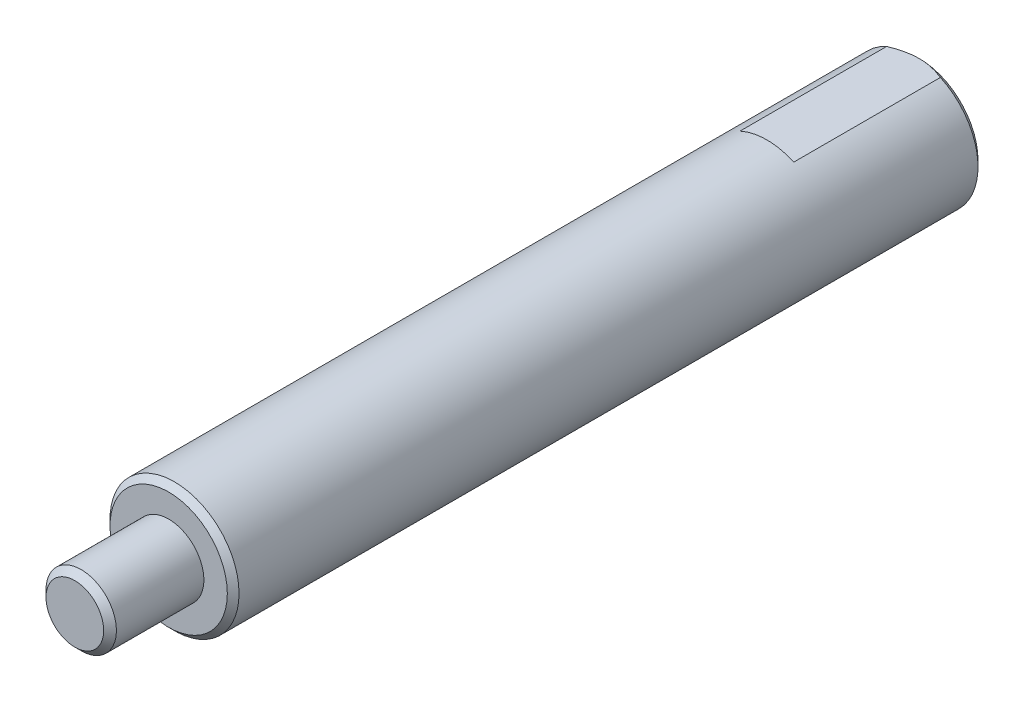
ISO-10303-21;
HEADER;
FILE_DESCRIPTION(('STEP AP214'),'2;1');
FILE_NAME('part.step','',(''),(''),'','','');
FILE_SCHEMA(('AUTOMOTIVE_DESIGN { 1 0 10303 214 1 1 1 1 }'));
ENDSEC;
DATA;
#1=APPLICATION_CONTEXT('core data for automotive mechanical design processes');
#2=APPLICATION_PROTOCOL_DEFINITION('international standard','automotive_design',2000,#1);
#3=PRODUCT_CONTEXT('',#1,'mechanical');
#4=PRODUCT('Part','Part','',(#3));
#5=PRODUCT_RELATED_PRODUCT_CATEGORY('part','',(#4));
#6=PRODUCT_DEFINITION_FORMATION('','',#4);
#7=PRODUCT_DEFINITION_CONTEXT('part definition',#1,'design');
#8=PRODUCT_DEFINITION('design','',#6,#7);
#9=PRODUCT_DEFINITION_SHAPE('','',#8);
#10=(LENGTH_UNIT() NAMED_UNIT(*) SI_UNIT(.MILLI.,.METRE.));
#11=(NAMED_UNIT(*) PLANE_ANGLE_UNIT() SI_UNIT($,.RADIAN.));
#12=(NAMED_UNIT(*) SI_UNIT($,.STERADIAN.) SOLID_ANGLE_UNIT());
#13=UNCERTAINTY_MEASURE_WITH_UNIT(LENGTH_MEASURE(1.E-05),#10,'distance_accuracy_value','');
#14=(GEOMETRIC_REPRESENTATION_CONTEXT(3) GLOBAL_UNCERTAINTY_ASSIGNED_CONTEXT((#13)) GLOBAL_UNIT_ASSIGNED_CONTEXT((#10,
#11,#12)) REPRESENTATION_CONTEXT('',''));
#15=CARTESIAN_POINT('',(0.,0.,0.));
#16=DIRECTION('',(0.,0.,1.));
#17=DIRECTION('',(1.,0.,0.));
#18=AXIS2_PLACEMENT_3D('',#15,#16,#17);
#19=CARTESIAN_POINT('',(0.,0.,0.500000000000014));
#20=DIRECTION('',(0.,0.,1.));
#21=DIRECTION('',(1.,0.,0.));
#22=AXIS2_PLACEMENT_3D('',#19,#20,#21);
#23=CONICAL_SURFACE('',#22,5.5,0.785398163397436);
#24=CARTESIAN_POINT('',(14.6848091307523,5.,10.5126921972504));
#25=CARTESIAN_POINT('',(14.4453208226164,5.,10.2859896541326));
#26=CARTESIAN_POINT('',(14.2055496886508,5.,10.0595855916862));
#27=CARTESIAN_POINT('',(13.7253433237663,5.,9.60748006149909));
#28=CARTESIAN_POINT('',(13.4849080888771,5.,9.38177859797625));
#29=CARTESIAN_POINT('',(12.7618962256913,5.,8.70536049882663));
#30=CARTESIAN_POINT('',(12.2781765081113,5.,8.25586410270808));
#31=CARTESIAN_POINT('',(11.2855202754837,5.,7.34194274282302));
#32=CARTESIAN_POINT('',(10.7764003173806,5.,6.87771631839156));
#33=CARTESIAN_POINT('',(10.0081237078524,5.,6.18705169530905));
#34=CARTESIAN_POINT('',(9.75140731219663,5.,5.95789999795178));
#35=CARTESIAN_POINT('',(9.23598125315529,5.,5.50185127115912));
#36=CARTESIAN_POINT('',(8.97727160895964,5.,5.27495422006529));
#37=CARTESIAN_POINT('',(8.45777334373329,5.,4.82431921159379));
#38=CARTESIAN_POINT('',(8.19698831207965,5.,4.60057712329857));
#39=CARTESIAN_POINT('',(7.6723358301828,5.,4.15670009726214));
#40=CARTESIAN_POINT('',(7.40846821574943,5.,3.93656535317621));
#41=CARTESIAN_POINT('',(6.87588577364982,5.,3.50025684420251));
#42=CARTESIAN_POINT('',(6.60715699098744,5.,3.28410005066126));
#43=CARTESIAN_POINT('',(6.06467897085518,5.,2.85824880719032));
#44=CARTESIAN_POINT('',(5.79093054202088,5.,2.64855333071812));
#45=CARTESIAN_POINT('',(5.24247824545996,5.,2.24225256251813));
#46=CARTESIAN_POINT('',(4.96790940819455,5.,2.04546689887278));
#47=CARTESIAN_POINT('',(4.54965992503194,5.,1.75937405975111));
#48=CARTESIAN_POINT('',(4.40911425501491,5.,1.66548481679918));
#49=CARTESIAN_POINT('',(4.12560555295664,5.,1.48143277641852));
#50=CARTESIAN_POINT('',(3.98264266122852,5.,1.39126976373159));
#51=CARTESIAN_POINT('',(3.69483138879475,5.,1.21601413329341));
#52=CARTESIAN_POINT('',(3.54999993591885,5.,1.13089382459616));
#53=CARTESIAN_POINT('',(3.25720950323702,5.,0.966134750499159));
#54=CARTESIAN_POINT('',(3.10925012756201,5.,0.886496684425168));
#55=CARTESIAN_POINT('',(2.81011276522707,5.,0.734125373534899));
#56=CARTESIAN_POINT('',(2.65894061859072,5.,0.661380726321783));
#57=CARTESIAN_POINT('',(2.35286256329088,5.,0.524242686166348));
#58=CARTESIAN_POINT('',(2.19795788752465,5.,0.459846579258957));
#59=CARTESIAN_POINT('',(1.96757107505065,5.,0.372774300731431));
#60=CARTESIAN_POINT('',(1.89359074216696,5.,0.346101437024991));
#61=CARTESIAN_POINT('',(1.74478391072081,5.,0.29522226419522));
#62=CARTESIAN_POINT('',(1.66995737392946,5.,0.271016067006829));
#63=CARTESIAN_POINT('',(1.44419485912767,5.,0.202417832217304));
#64=CARTESIAN_POINT('',(1.29200049197949,5.,0.162055560028303));
#65=CARTESIAN_POINT('',(0.985646477349682,5.,0.0940487123557584));
#66=CARTESIAN_POINT('',(0.831502220583022,5.,0.0663354854096574));
#67=CARTESIAN_POINT('',(0.521341182897351,5.,0.0247588689838609));
#68=CARTESIAN_POINT('',(0.365324622093381,5.,0.0108938672889773));
#69=CARTESIAN_POINT('',(0.0516160098077244,5.,-0.00220571628048557));
#70=CARTESIAN_POINT('',(-0.106080254029073,5.,-0.00134130349867582));
#71=CARTESIAN_POINT('',(-0.420679844237679,5.,0.0152055027274822));
#72=CARTESIAN_POINT('',(-0.577583163482885,5.,0.0308880291126165));
#73=CARTESIAN_POINT('',(-0.890071145810949,5.,0.0762385891217889));
#74=CARTESIAN_POINT('',(-1.04564624986767,5.,0.105971488681403));
#75=CARTESIAN_POINT('',(-1.35387421816534,5.,0.177884717280971));
#76=CARTESIAN_POINT('',(-1.50652647420562,5.,0.220067607636027));
#77=CARTESIAN_POINT('',(-1.8989922814402,5.,0.343556358459082));
#78=CARTESIAN_POINT('',(-2.13618939052751,5.,0.433155135839272));
#79=CARTESIAN_POINT('',(-2.60192397109214,5.,0.632544932175374));
#80=CARTESIAN_POINT('',(-2.83045405488646,5.,0.7423527303823));
#81=CARTESIAN_POINT('',(-3.16847602424685,5.,0.918609391765032));
#82=CARTESIAN_POINT('',(-3.28087217249392,5.,0.979600606049237));
#83=CARTESIAN_POINT('',(-3.50386518493547,5.,1.10479681409978));
#84=CARTESIAN_POINT('',(-3.6144620260023,5.,1.16900184913222));
#85=CARTESIAN_POINT('',(-3.83396126584069,5.,1.30012039469541));
#86=CARTESIAN_POINT('',(-3.94286443721314,5.,1.36703261693885));
#87=CARTESIAN_POINT('',(-4.1591802464683,5.,1.50320934076131));
#88=CARTESIAN_POINT('',(-4.26659294268043,5.,1.57247374992024));
#89=CARTESIAN_POINT('',(-4.62241235734253,5.,1.80671898738853));
#90=CARTESIAN_POINT('',(-4.86786587008758,5.,1.97619150842273));
#91=CARTESIAN_POINT('',(-5.3531269237751,5.,2.32306349681855));
#92=CARTESIAN_POINT('',(-5.59293322072314,5.,2.50046468625841));
#93=CARTESIAN_POINT('',(-6.06824445724655,5.,2.86127560728337));
#94=CARTESIAN_POINT('',(-6.30374612411092,5.,3.04468963665715));
#95=CARTESIAN_POINT('',(-6.77116765089281,5.,3.41597165684243));
#96=CARTESIAN_POINT('',(-7.0030877979389,5.,3.6038392875176));
#97=CARTESIAN_POINT('',(-7.46479831203241,5.,3.98364854891996));
#98=CARTESIAN_POINT('',(-7.69457957218798,5.,4.17560122632323));
#99=CARTESIAN_POINT('',(-8.15180534086126,5.,4.56227258082238));
#100=CARTESIAN_POINT('',(-8.37924980937841,5.,4.7569913051312));
#101=CARTESIAN_POINT('',(-8.83212152767281,5.,5.14856830192763));
#102=CARTESIAN_POINT('',(-9.05754957794634,5.,5.34542564979219));
#103=CARTESIAN_POINT('',(-9.50680949169838,5.,5.74095449633187));
#104=CARTESIAN_POINT('',(-9.73064134364065,5.,5.93962600809492));
#105=CARTESIAN_POINT('',(-10.3554269609866,5.,6.49792304019951));
#106=CARTESIAN_POINT('',(-10.7548894567916,5.,6.85921712231994));
#107=CARTESIAN_POINT('',(-11.5506520435187,5.,7.58535654201267));
#108=CARTESIAN_POINT('',(-11.9469517546501,5.,7.95020229473558));
#109=CARTESIAN_POINT('',(-12.7346046209224,5.,8.68021687945504));
#110=CARTESIAN_POINT('',(-13.1259732089029,5.,9.04536907885108));
#111=CARTESIAN_POINT('',(-13.9067337252454,5.,9.77766414097995));
#112=CARTESIAN_POINT('',(-14.2961259422756,5.,10.1448066957958));
#113=CARTESIAN_POINT('',(-14.6848091307523,5.,10.5126921972504));
#114=B_SPLINE_CURVE_WITH_KNOTS('',3,(#24,#25,#26,#27,#28,#29,#30,#31,#32,#33,#34,#35,#36,#37,
#38,#39,#40,#41,#42,#43,#44,#45,#46,#47,#48,#49,#50,#51,#52,#53,#54,#55,#56,#57,#58,#59,#60,#61,
#62,#63,#64,#65,#66,#67,#68,#69,#70,#71,#72,#73,#74,#75,#76,#77,#78,#79,#80,#81,#82,#83,#84,#85,
#86,#87,#88,#89,#90,#91,#92,#93,#94,#95,#96,#97,#98,#99,#100,#101,#102,#103,#104,#105,#106,#107,
#108,#109,#110,#111,#112,#113),.UNSPECIFIED.,.F.,.F.,(4,2,2,2,2,2,2,2,2,2,2,2,2,2,2,2,2,2,2,2,2,
2,2,2,2,2,2,2,2,2,2,2,2,2,2,2,2,2,2,2,2,2,2,2,4),(0.,0.989311923310689,1.97862977419087,
3.95959337600434,6.02651317448638,7.05884240046647,8.09116170015287,9.12197286482393,
10.152839187069,11.1873903696079,12.2217763312275,13.2349233326129,13.7419424161495,
14.248932168968,14.7528143978993,15.2567607843965,15.7598584856985,16.262792226395,
16.4986794127487,16.7345772986724,17.2064516788891,17.6757336299648,18.1449609407026,
18.6173431093413,19.0897295159994,19.5643184047898,20.0390049980705,20.7982977886032,
21.5582238763938,21.9418160729213,22.3254131961139,22.7088298733644,23.0922315031272,
23.9868071792112,24.881578107225,25.7770031658041,26.6723560620074,27.5705534283755,
28.4687661443101,29.3666048627675,30.2644500636273,31.8802558929096,33.4962529155438,
35.1020309687593,36.7075673131423),.UNSPECIFIED.);
#115=CARTESIAN_POINT('',(2.29128784747799,5.,0.499999999999995));
#116=VERTEX_POINT('',#115);
#117=CARTESIAN_POINT('',(0.,5.,0.));
#118=VERTEX_POINT('',#117);
#119=EDGE_CURVE('E56',#116,#118,#114,.T.);
#120=ORIENTED_EDGE('',*,*,#119,.F.);
#121=CARTESIAN_POINT('',(0.,0.,0.500000000000014));
#122=DIRECTION('',(0.,0.,1.));
#123=DIRECTION('',(1.,0.,0.));
#124=AXIS2_PLACEMENT_3D('',#121,#122,#123);
#125=CIRCLE('',#124,5.5);
#126=CARTESIAN_POINT('',(2.29128784747792,-5.,0.500000000000014));
#127=VERTEX_POINT('',#126);
#128=EDGE_CURVE('E125',#127,#116,#125,.T.);
#129=ORIENTED_EDGE('',*,*,#128,.F.);
#130=CARTESIAN_POINT('',(-14.6848091307523,-5.,10.5126921972504));
#131=CARTESIAN_POINT('',(-14.4453208226164,-5.,10.2859896541326));
#132=CARTESIAN_POINT('',(-14.2055496886508,-5.,10.0595855916861));
#133=CARTESIAN_POINT('',(-13.7253433237663,-5.,9.60748006149909));
#134=CARTESIAN_POINT('',(-13.4849080888771,-5.,9.38177859797625));
#135=CARTESIAN_POINT('',(-12.7618962256913,-5.,8.70536049882663));
#136=CARTESIAN_POINT('',(-12.2781765081113,-5.,8.25586410270807));
#137=CARTESIAN_POINT('',(-11.2855202754837,-5.,7.34194274282302));
#138=CARTESIAN_POINT('',(-10.7764003173806,-5.,6.87771631839156));
#139=CARTESIAN_POINT('',(-10.0081237078524,-5.,6.18705169530905));
#140=CARTESIAN_POINT('',(-9.75140731219662,-5.,5.95789999795178));
#141=CARTESIAN_POINT('',(-9.23598125315529,-5.,5.50185127115912));
#142=CARTESIAN_POINT('',(-8.97727160895964,-5.,5.27495422006529));
#143=CARTESIAN_POINT('',(-8.45777334373329,-5.,4.82431921159379));
#144=CARTESIAN_POINT('',(-8.19698831207965,-5.,4.60057712329857));
#145=CARTESIAN_POINT('',(-7.6723358301828,-5.,4.15670009726214));
#146=CARTESIAN_POINT('',(-7.40846821574943,-5.,3.93656535317622));
#147=CARTESIAN_POINT('',(-6.87588577364982,-5.,3.50025684420251));
#148=CARTESIAN_POINT('',(-6.60715699098744,-5.,3.28410005066126));
#149=CARTESIAN_POINT('',(-6.06467897085518,-5.,2.85824880719032));
#150=CARTESIAN_POINT('',(-5.79093054202088,-5.,2.64855333071812));
#151=CARTESIAN_POINT('',(-5.24247824545997,-5.,2.24225256251813));
#152=CARTESIAN_POINT('',(-4.96790940819455,-5.,2.04546689887279));
#153=CARTESIAN_POINT('',(-4.54965992503194,-5.,1.75937405975111));
#154=CARTESIAN_POINT('',(-4.40911425501492,-5.,1.66548481679918));
#155=CARTESIAN_POINT('',(-4.12560555295664,-5.,1.48143277641852));
#156=CARTESIAN_POINT('',(-3.98264266122852,-5.,1.39126976373159));
#157=CARTESIAN_POINT('',(-3.69483138879475,-5.,1.21601413329342));
#158=CARTESIAN_POINT('',(-3.54999993591886,-5.,1.13089382459616));
#159=CARTESIAN_POINT('',(-3.25720950323703,-5.,0.966134750499163));
#160=CARTESIAN_POINT('',(-3.10925012756201,-5.,0.886496684425172));
#161=CARTESIAN_POINT('',(-2.81011276522707,-5.,0.734125373534903));
#162=CARTESIAN_POINT('',(-2.65894061859073,-5.,0.661380726321787));
#163=CARTESIAN_POINT('',(-2.35286256329088,-5.,0.524242686166353));
#164=CARTESIAN_POINT('',(-2.19795788752466,-5.,0.45984657925896));
#165=CARTESIAN_POINT('',(-1.96757107505066,-5.,0.372774300731434));
#166=CARTESIAN_POINT('',(-1.89359074216697,-5.,0.346101437024994));
#167=CARTESIAN_POINT('',(-1.74478391072082,-5.,0.295222264195223));
#168=CARTESIAN_POINT('',(-1.66995737392947,-5.,0.271016067006833));
#169=CARTESIAN_POINT('',(-1.44419485912768,-5.,0.202417832217307));
#170=CARTESIAN_POINT('',(-1.2920004919795,-5.,0.162055560028306));
#171=CARTESIAN_POINT('',(-0.985646477349691,-5.,0.0940487123557596));
#172=CARTESIAN_POINT('',(-0.831502220583031,-5.,0.0663354854096585));
#173=CARTESIAN_POINT('',(-0.521341182897359,-5.,0.0247588689838614));
#174=CARTESIAN_POINT('',(-0.365324622093389,-5.,0.0108938672889776));
#175=CARTESIAN_POINT('',(-0.0516160098077298,-5.,-0.00220571628048559));
#176=CARTESIAN_POINT('',(0.106080254029068,-5.,-0.00134130349867597));
#177=CARTESIAN_POINT('',(0.420679844237675,-5.,0.0152055027274823));
#178=CARTESIAN_POINT('',(0.57758316348288,-5.,0.0308880291126169));
#179=CARTESIAN_POINT('',(0.890071145810944,-5.,0.0762385891217886));
#180=CARTESIAN_POINT('',(1.04564624986766,-5.,0.105971488681402));
#181=CARTESIAN_POINT('',(1.35387421816534,-5.,0.177884717280969));
#182=CARTESIAN_POINT('',(1.50652647420562,-5.,0.220067607636025));
#183=CARTESIAN_POINT('',(1.8989922814402,-5.,0.34355635845908));
#184=CARTESIAN_POINT('',(2.13618939052751,-5.,0.433155135839271));
#185=CARTESIAN_POINT('',(2.60192397109214,-5.,0.632544932175372));
#186=CARTESIAN_POINT('',(2.83045405488645,-5.,0.742352730382296));
#187=CARTESIAN_POINT('',(3.16847602424685,-5.,0.918609391765028));
#188=CARTESIAN_POINT('',(3.28087217249391,-5.,0.979600606049233));
#189=CARTESIAN_POINT('',(3.50386518493546,-5.,1.10479681409978));
#190=CARTESIAN_POINT('',(3.6144620260023,-5.,1.16900184913222));
#191=CARTESIAN_POINT('',(3.83396126584068,-5.,1.30012039469541));
#192=CARTESIAN_POINT('',(3.94286443721313,-5.,1.36703261693884));
#193=CARTESIAN_POINT('',(4.15918024646829,-5.,1.50320934076131));
#194=CARTESIAN_POINT('',(4.26659294268042,-5.,1.57247374992024));
#195=CARTESIAN_POINT('',(4.62241235734252,-5.,1.80671898738852));
#196=CARTESIAN_POINT('',(4.86786587008757,-5.,1.97619150842272));
#197=CARTESIAN_POINT('',(5.35312692377509,-5.,2.32306349681854));
#198=CARTESIAN_POINT('',(5.59293322072313,-5.,2.5004646862584));
#199=CARTESIAN_POINT('',(6.06824445724655,-5.,2.86127560728336));
#200=CARTESIAN_POINT('',(6.30374612411091,-5.,3.04468963665714));
#201=CARTESIAN_POINT('',(6.7711676508928,-5.,3.41597165684243));
#202=CARTESIAN_POINT('',(7.0030877979389,-5.,3.6038392875176));
#203=CARTESIAN_POINT('',(7.4647983120324,-5.,3.98364854891996));
#204=CARTESIAN_POINT('',(7.69457957218797,-5.,4.17560122632323));
#205=CARTESIAN_POINT('',(8.15180534086126,-5.,4.56227258082238));
#206=CARTESIAN_POINT('',(8.37924980937841,-5.,4.7569913051312));
#207=CARTESIAN_POINT('',(8.83212152767281,-5.,5.14856830192763));
#208=CARTESIAN_POINT('',(9.05754957794634,-5.,5.34542564979219));
#209=CARTESIAN_POINT('',(9.50680949169838,-5.,5.74095449633188));
#210=CARTESIAN_POINT('',(9.73064134364065,-5.,5.93962600809492));
#211=CARTESIAN_POINT('',(10.3554269609866,-5.,6.49792304019951));
#212=CARTESIAN_POINT('',(10.7548894567916,-5.,6.85921712231994));
#213=CARTESIAN_POINT('',(11.5506520435187,-5.,7.58535654201267));
#214=CARTESIAN_POINT('',(11.9469517546501,-5.,7.95020229473559));
#215=CARTESIAN_POINT('',(12.7346046209224,-5.,8.68021687945504));
#216=CARTESIAN_POINT('',(13.1259732089029,-5.,9.04536907885108));
#217=CARTESIAN_POINT('',(13.9067337252454,-5.,9.77766414097995));
#218=CARTESIAN_POINT('',(14.2961259422756,-5.,10.1448066957958));
#219=CARTESIAN_POINT('',(14.6848091307523,-5.,10.5126921972504));
#220=B_SPLINE_CURVE_WITH_KNOTS('',3,(#130,#131,#132,#133,#134,#135,#136,#137,#138,#139,#140,
#141,#142,#143,#144,#145,#146,#147,#148,#149,#150,#151,#152,#153,#154,#155,#156,#157,#158,#159,
#160,#161,#162,#163,#164,#165,#166,#167,#168,#169,#170,#171,#172,#173,#174,#175,#176,#177,#178,
#179,#180,#181,#182,#183,#184,#185,#186,#187,#188,#189,#190,#191,#192,#193,#194,#195,#196,#197,
#198,#199,#200,#201,#202,#203,#204,#205,#206,#207,#208,#209,#210,#211,#212,#213,#214,#215,#216,
#217,#218,#219),.UNSPECIFIED.,.F.,.F.,(4,2,2,2,2,2,2,2,2,2,2,2,2,2,2,2,2,2,2,2,2,2,2,2,2,2,2,2,
2,2,2,2,2,2,2,2,2,2,2,2,2,2,2,2,4),(0.,0.989311923310689,1.97862977419087,3.95959337600434,
6.02651317448638,7.05884240046647,8.09116170015286,9.12197286482393,10.152839187069,
11.1873903696079,12.2217763312275,13.2349233326129,13.7419424161494,14.248932168968,
14.7528143978992,15.2567607843965,15.7598584856985,16.262792226395,16.4986794127487,
16.7345772986723,17.2064516788891,17.6757336299648,18.1449609407026,18.6173431093413,
19.0897295159994,19.5643184047898,20.0390049980705,20.7982977886031,21.5582238763938,
21.9418160729213,22.3254131961138,22.7088298733644,23.0922315031272,23.9868071792112,
24.881578107225,25.7770031658041,26.6723560620074,27.5705534283755,28.4687661443101,
29.3666048627675,30.2644500636273,31.8802558929096,33.4962529155438,35.1020309687593,
36.7075673131423),.UNSPECIFIED.);
#221=CARTESIAN_POINT('',(0.,-5.,0.));
#222=VERTEX_POINT('',#221);
#223=EDGE_CURVE('E141',#222,#127,#220,.T.);
#224=ORIENTED_EDGE('',*,*,#223,.F.);
#225=CARTESIAN_POINT('',(0.,0.,0.));
#226=DIRECTION('',(0.,0.,1.));
#227=DIRECTION('',(1.,0.,0.));
#228=AXIS2_PLACEMENT_3D('',#225,#226,#227);
#229=CIRCLE('',#228,5.);
#230=EDGE_CURVE('E132',#118,#222,#229,.F.);
#231=ORIENTED_EDGE('',*,*,#230,.F.);
#232=EDGE_LOOP('',(#120,#129,#224,#231));
#233=FACE_BOUND('',#232,.T.);
#234=ADVANCED_FACE('F41',(#233),#23,.T.);
#235=CARTESIAN_POINT('',(0.,0.,64.));
#236=DIRECTION('',(0.,0.,1.));
#237=DIRECTION('',(1.,0.,0.));
#238=AXIS2_PLACEMENT_3D('',#235,#236,#237);
#239=PLANE('',#238);
#240=CARTESIAN_POINT('',(0.,0.,64.));
#241=DIRECTION('',(0.,0.,1.));
#242=DIRECTION('',(1.,0.,0.));
#243=AXIS2_PLACEMENT_3D('',#240,#241,#242);
#244=CIRCLE('',#243,4.99999999999999);
#245=CARTESIAN_POINT('',(4.99999999999999,0.,64.));
#246=VERTEX_POINT('',#245);
#247=EDGE_CURVE('E131',#246,#246,#244,.T.);
#248=ORIENTED_EDGE('',*,*,#247,.T.);
#249=EDGE_LOOP('',(#248));
#250=FACE_BOUND('',#249,.T.);
#251=CARTESIAN_POINT('',(0.,0.,64.));
#252=DIRECTION('',(0.,0.,-1.));
#253=DIRECTION('',(-1.,0.,0.));
#254=AXIS2_PLACEMENT_3D('',#251,#252,#253);
#255=CIRCLE('',#254,3.);
#256=CARTESIAN_POINT('',(-3.,0.,64.));
#257=VERTEX_POINT('',#256);
#258=EDGE_CURVE('E100',#257,#257,#255,.T.);
#259=ORIENTED_EDGE('',*,*,#258,.T.);
#260=EDGE_LOOP('',(#259));
#261=FACE_BOUND('',#260,.T.);
#262=ADVANCED_FACE('F177',(#250,#261),#239,.T.);
#263=CARTESIAN_POINT('',(0.,0.,64.));
#264=DIRECTION('',(0.,0.,-1.));
#265=DIRECTION('',(-1.,0.,0.));
#266=AXIS2_PLACEMENT_3D('',#263,#264,#265);
#267=CYLINDRICAL_SURFACE('',#266,5.5);
#268=CARTESIAN_POINT('',(0.,0.,13.));
#269=DIRECTION('',(0.,0.,-1.));
#270=DIRECTION('',(-1.,0.,0.));
#271=AXIS2_PLACEMENT_3D('',#268,#269,#270);
#272=CIRCLE('',#271,5.5);
#273=CARTESIAN_POINT('',(-2.29128784747792,5.,13.));
#274=VERTEX_POINT('',#273);
#275=CARTESIAN_POINT('',(2.29128784747792,5.,13.));
#276=VERTEX_POINT('',#275);
#277=EDGE_CURVE('E11',#274,#276,#272,.T.);
#278=ORIENTED_EDGE('',*,*,#277,.F.);
#279=DIRECTION('',(0.,0.,-1.));
#280=VECTOR('',#279,1.);
#281=CARTESIAN_POINT('',(-2.29128784747792,5.,64.));
#282=LINE('',#281,#280);
#283=CARTESIAN_POINT('',(-2.29128784747792,5.,0.500000000000014));
#284=VERTEX_POINT('',#283);
#285=EDGE_CURVE('E117',#274,#284,#282,.T.);
#286=ORIENTED_EDGE('',*,*,#285,.T.);
#287=CARTESIAN_POINT('',(-2.29128784747799,-5.,0.499999999999995));
#288=VERTEX_POINT('',#287);
#289=EDGE_CURVE('E108',#284,#288,#125,.T.);
#290=ORIENTED_EDGE('',*,*,#289,.T.);
#291=DIRECTION('',(0.,0.,-1.));
#292=VECTOR('',#291,1.);
#293=CARTESIAN_POINT('',(-2.29128784747792,-5.,64.));
#294=LINE('',#293,#292);
#295=CARTESIAN_POINT('',(-2.29128784747792,-5.,13.));
#296=VERTEX_POINT('',#295);
#297=EDGE_CURVE('E97',#288,#296,#294,.F.);
#298=ORIENTED_EDGE('',*,*,#297,.T.);
#299=CARTESIAN_POINT('',(0.,0.,13.));
#300=DIRECTION('',(0.,0.,1.));
#301=DIRECTION('',(1.,0.,0.));
#302=AXIS2_PLACEMENT_3D('',#299,#300,#301);
#303=CIRCLE('',#302,5.5);
#304=CARTESIAN_POINT('',(2.29128784747792,-5.,13.));
#305=VERTEX_POINT('',#304);
#306=EDGE_CURVE('E49',#296,#305,#303,.T.);
#307=ORIENTED_EDGE('',*,*,#306,.T.);
#308=DIRECTION('',(0.,0.,-1.));
#309=VECTOR('',#308,1.);
#310=CARTESIAN_POINT('',(2.29128784747792,-5.,64.));
#311=LINE('',#310,#309);
#312=EDGE_CURVE('E98',#305,#127,#311,.T.);
#313=ORIENTED_EDGE('',*,*,#312,.T.);
#314=ORIENTED_EDGE('',*,*,#128,.T.);
#315=DIRECTION('',(0.,0.,-1.));
#316=VECTOR('',#315,1.);
#317=CARTESIAN_POINT('',(2.29128784747792,5.,64.));
#318=LINE('',#317,#316);
#319=EDGE_CURVE('E110',#116,#276,#318,.F.);
#320=ORIENTED_EDGE('',*,*,#319,.T.);
#321=EDGE_LOOP('',(#278,#286,#290,#298,#307,#313,#314,#320));
#322=FACE_BOUND('',#321,.T.);
#323=CARTESIAN_POINT('',(0.,0.,63.5));
#324=DIRECTION('',(0.,0.,1.));
#325=DIRECTION('',(1.,0.,0.));
#326=AXIS2_PLACEMENT_3D('',#323,#324,#325);
#327=CIRCLE('',#326,5.5);
#328=CARTESIAN_POINT('',(5.5,0.,63.5));
#329=VERTEX_POINT('',#328);
#330=EDGE_CURVE('E122',#329,#329,#327,.F.);
#331=ORIENTED_EDGE('',*,*,#330,.T.);
#332=EDGE_LOOP('',(#331));
#333=FACE_BOUND('',#332,.T.);
#334=ADVANCED_FACE('F104',(#322,#333),#267,.T.);
#335=CARTESIAN_POINT('',(0.,0.,0.));
#336=DIRECTION('',(0.,0.,1.));
#337=DIRECTION('',(1.,0.,0.));
#338=AXIS2_PLACEMENT_3D('',#335,#336,#337);
#339=PLANE('',#338);
#340=CARTESIAN_POINT('',(0.,0.,0.));
#341=DIRECTION('',(0.,0.,1.));
#342=DIRECTION('',(1.,0.,0.));
#343=AXIS2_PLACEMENT_3D('',#340,#341,#342);
#344=CIRCLE('',#343,2.6);
#345=CARTESIAN_POINT('',(2.6,0.,0.));
#346=VERTEX_POINT('',#345);
#347=EDGE_CURVE('E138',#346,#346,#344,.T.);
#348=ORIENTED_EDGE('',*,*,#347,.T.);
#349=EDGE_LOOP('',(#348));
#350=FACE_BOUND('',#349,.T.);
#351=EDGE_CURVE('E128',#222,#118,#229,.F.);
#352=ORIENTED_EDGE('',*,*,#351,.T.);
#353=ORIENTED_EDGE('',*,*,#230,.T.);
#354=EDGE_LOOP('',(#352,#353));
#355=FACE_BOUND('',#354,.T.);
#356=ADVANCED_FACE('F181',(#350,#355),#339,.F.);
#357=EDGE_CURVE('E149',#118,#284,#114,.T.);
#358=ORIENTED_EDGE('',*,*,#357,.F.);
#359=ORIENTED_EDGE('',*,*,#351,.F.);
#360=EDGE_CURVE('E64',#288,#222,#220,.T.);
#361=ORIENTED_EDGE('',*,*,#360,.F.);
#362=ORIENTED_EDGE('',*,*,#289,.F.);
#363=EDGE_LOOP('',(#358,#359,#361,#362));
#364=FACE_BOUND('',#363,.T.);
#365=ADVANCED_FACE('F155',(#364),#23,.T.);
#366=CARTESIAN_POINT('',(0.,0.,64.));
#367=DIRECTION('',(0.,0.,-1.));
#368=DIRECTION('',(-1.,0.,0.));
#369=AXIS2_PLACEMENT_3D('',#366,#367,#368);
#370=CONICAL_SURFACE('',#369,4.99999999999999,0.785398163397443);
#371=ORIENTED_EDGE('',*,*,#330,.F.);
#372=EDGE_LOOP('',(#371));
#373=FACE_BOUND('',#372,.T.);
#374=ORIENTED_EDGE('',*,*,#247,.F.);
#375=EDGE_LOOP('',(#374));
#376=FACE_BOUND('',#375,.T.);
#377=ADVANCED_FACE('F170',(#373,#376),#370,.T.);
#378=CARTESIAN_POINT('',(0.,0.,12.4));
#379=DIRECTION('',(0.,0.,-1.));
#380=DIRECTION('',(-1.,0.,0.));
#381=AXIS2_PLACEMENT_3D('',#378,#379,#380);
#382=CONICAL_SURFACE('',#381,2.1,1.02974425867665);
#383=CARTESIAN_POINT('',(0.,0.,13.6618072999579));
#384=VERTEX_POINT('',#383);
#385=VERTEX_LOOP('',#384);
#386=FACE_BOUND('',#385,.T.);
#387=CARTESIAN_POINT('',(0.,0.,12.4));
#388=DIRECTION('',(0.,0.,-1.));
#389=DIRECTION('',(-1.,0.,0.));
#390=AXIS2_PLACEMENT_3D('',#387,#388,#389);
#391=CIRCLE('',#390,2.1);
#392=CARTESIAN_POINT('',(-2.1,0.,12.4));
#393=VERTEX_POINT('',#392);
#394=EDGE_CURVE('E119',#393,#393,#391,.T.);
#395=ORIENTED_EDGE('',*,*,#394,.T.);
#396=EDGE_LOOP('',(#395));
#397=FACE_BOUND('',#396,.T.);
#398=ADVANCED_FACE('F166',(#386,#397),#382,.F.);
#399=CARTESIAN_POINT('',(0.,0.,0.));
#400=DIRECTION('',(0.,0.,-1.));
#401=DIRECTION('',(-1.,0.,0.));
#402=AXIS2_PLACEMENT_3D('',#399,#400,#401);
#403=CYLINDRICAL_SURFACE('',#402,2.1);
#404=CARTESIAN_POINT('',(0.,0.,0.5));
#405=DIRECTION('',(0.,0.,1.));
#406=DIRECTION('',(1.,0.,0.));
#407=AXIS2_PLACEMENT_3D('',#404,#405,#406);
#408=CIRCLE('',#407,2.1);
#409=CARTESIAN_POINT('',(2.1,0.,0.5));
#410=VERTEX_POINT('',#409);
#411=EDGE_CURVE('E135',#410,#410,#408,.F.);
#412=ORIENTED_EDGE('',*,*,#411,.T.);
#413=EDGE_LOOP('',(#412));
#414=FACE_BOUND('',#413,.T.);
#415=ORIENTED_EDGE('',*,*,#394,.F.);
#416=EDGE_LOOP('',(#415));
#417=FACE_BOUND('',#416,.T.);
#418=ADVANCED_FACE('F163',(#414,#417),#403,.F.);
#419=CARTESIAN_POINT('',(0.,0.,0.5));
#420=DIRECTION('',(0.,0.,-1.));
#421=DIRECTION('',(-1.,0.,0.));
#422=AXIS2_PLACEMENT_3D('',#419,#420,#421);
#423=CONICAL_SURFACE('',#422,2.1,0.785398163397455);
#424=ORIENTED_EDGE('',*,*,#347,.F.);
#425=EDGE_LOOP('',(#424));
#426=FACE_BOUND('',#425,.T.);
#427=ORIENTED_EDGE('',*,*,#411,.F.);
#428=EDGE_LOOP('',(#427));
#429=FACE_BOUND('',#428,.T.);
#430=ADVANCED_FACE('F43',(#426,#429),#423,.F.);
#431=CARTESIAN_POINT('',(0.,0.,13.));
#432=DIRECTION('',(0.,0.,1.));
#433=DIRECTION('',(1.,0.,0.));
#434=AXIS2_PLACEMENT_3D('',#431,#432,#433);
#435=PLANE('',#434);
#436=DIRECTION('',(1.,0.,0.));
#437=VECTOR('',#436,1.);
#438=CARTESIAN_POINT('',(5.,-5.,13.));
#439=LINE('',#438,#437);
#440=EDGE_CURVE('E92',#296,#305,#439,.T.);
#441=ORIENTED_EDGE('',*,*,#440,.T.);
#442=ORIENTED_EDGE('',*,*,#306,.F.);
#443=EDGE_LOOP('',(#441,#442));
#444=FACE_BOUND('',#443,.T.);
#445=ADVANCED_FACE('F91',(#444),#435,.F.);
#446=CARTESIAN_POINT('',(5.,-5.,13.));
#447=DIRECTION('',(0.,1.,0.));
#448=DIRECTION('',(0.,0.,1.));
#449=AXIS2_PLACEMENT_3D('',#446,#447,#448);
#450=PLANE('',#449);
#451=ORIENTED_EDGE('',*,*,#440,.F.);
#452=ORIENTED_EDGE('',*,*,#297,.F.);
#453=ORIENTED_EDGE('',*,*,#360,.T.);
#454=ORIENTED_EDGE('',*,*,#223,.T.);
#455=ORIENTED_EDGE('',*,*,#312,.F.);
#456=EDGE_LOOP('',(#451,#452,#453,#454,#455));
#457=FACE_BOUND('',#456,.T.);
#458=ADVANCED_FACE('F96',(#457),#450,.F.);
#459=CARTESIAN_POINT('',(0.,0.,13.));
#460=DIRECTION('',(0.,0.,-1.));
#461=DIRECTION('',(-1.,0.,0.));
#462=AXIS2_PLACEMENT_3D('',#459,#460,#461);
#463=PLANE('',#462);
#464=ORIENTED_EDGE('',*,*,#277,.T.);
#465=DIRECTION('',(-1.,0.,0.));
#466=VECTOR('',#465,1.);
#467=CARTESIAN_POINT('',(5.,5.,13.));
#468=LINE('',#467,#466);
#469=EDGE_CURVE('E99',#276,#274,#468,.T.);
#470=ORIENTED_EDGE('',*,*,#469,.T.);
#471=EDGE_LOOP('',(#464,#470));
#472=FACE_BOUND('',#471,.T.);
#473=ADVANCED_FACE('F162',(#472),#463,.T.);
#474=CARTESIAN_POINT('',(5.,5.,13.));
#475=DIRECTION('',(0.,-1.,0.));
#476=DIRECTION('',(0.,0.,-1.));
#477=AXIS2_PLACEMENT_3D('',#474,#475,#476);
#478=PLANE('',#477);
#479=ORIENTED_EDGE('',*,*,#469,.F.);
#480=ORIENTED_EDGE('',*,*,#319,.F.);
#481=ORIENTED_EDGE('',*,*,#119,.T.);
#482=ORIENTED_EDGE('',*,*,#357,.T.);
#483=ORIENTED_EDGE('',*,*,#285,.F.);
#484=EDGE_LOOP('',(#479,#480,#481,#482,#483));
#485=FACE_BOUND('',#484,.T.);
#486=ADVANCED_FACE('F203',(#485),#478,.F.);
#487=CARTESIAN_POINT('',(0.,0.,72.));
#488=DIRECTION('',(0.,0.,-1.));
#489=DIRECTION('',(-1.,0.,0.));
#490=AXIS2_PLACEMENT_3D('',#487,#488,#489);
#491=CYLINDRICAL_SURFACE('',#490,3.);
#492=ORIENTED_EDGE('',*,*,#258,.F.);
#493=EDGE_LOOP('',(#492));
#494=FACE_BOUND('',#493,.T.);
#495=CARTESIAN_POINT('',(0.,0.,71.4585));
#496=DIRECTION('',(0.,0.,-1.));
#497=DIRECTION('',(-1.,0.,0.));
#498=AXIS2_PLACEMENT_3D('',#495,#496,#497);
#499=CIRCLE('',#498,3.);
#500=CARTESIAN_POINT('',(-3.,0.,71.4585));
#501=VERTEX_POINT('',#500);
#502=EDGE_CURVE('E223',#501,#501,#499,.T.);
#503=ORIENTED_EDGE('',*,*,#502,.T.);
#504=EDGE_LOOP('',(#503));
#505=FACE_BOUND('',#504,.T.);
#506=ADVANCED_FACE('F210',(#494,#505),#491,.T.);
#507=CARTESIAN_POINT('',(0.,0.,72.));
#508=DIRECTION('',(0.,0.,-1.));
#509=DIRECTION('',(-1.,0.,0.));
#510=AXIS2_PLACEMENT_3D('',#507,#508,#509);
#511=CONICAL_SURFACE('',#510,2.4585,0.785398163397448);
#512=ORIENTED_EDGE('',*,*,#502,.F.);
#513=EDGE_LOOP('',(#512));
#514=FACE_BOUND('',#513,.T.);
#515=CARTESIAN_POINT('',(0.,0.,72.));
#516=DIRECTION('',(0.,0.,-1.));
#517=DIRECTION('',(-1.,0.,0.));
#518=AXIS2_PLACEMENT_3D('',#515,#516,#517);
#519=CIRCLE('',#518,2.4585);
#520=CARTESIAN_POINT('',(-2.4585,0.,72.));
#521=VERTEX_POINT('',#520);
#522=EDGE_CURVE('E226',#521,#521,#519,.T.);
#523=ORIENTED_EDGE('',*,*,#522,.T.);
#524=EDGE_LOOP('',(#523));
#525=FACE_BOUND('',#524,.T.);
#526=ADVANCED_FACE('F175',(#514,#525),#511,.T.);
#527=CARTESIAN_POINT('',(0.,0.,72.));
#528=DIRECTION('',(0.,0.,1.));
#529=DIRECTION('',(1.,0.,0.));
#530=AXIS2_PLACEMENT_3D('',#527,#528,#529);
#531=PLANE('',#530);
#532=ORIENTED_EDGE('',*,*,#522,.F.);
#533=EDGE_LOOP('',(#532));
#534=FACE_BOUND('',#533,.T.);
#535=ADVANCED_FACE('F172',(#534),#531,.T.);
#536=CLOSED_SHELL('',(#234,#262,#334,#356,#365,#377,#398,#418,#430,#445,#458,#473,#486,#506,
#526,#535));
#537=MANIFOLD_SOLID_BREP('B2',#536);
#538=ADVANCED_BREP_SHAPE_REPRESENTATION('',(#18,#537),#14);
#539=SHAPE_DEFINITION_REPRESENTATION(#9,#538);
ENDSEC;
END-ISO-10303-21;
